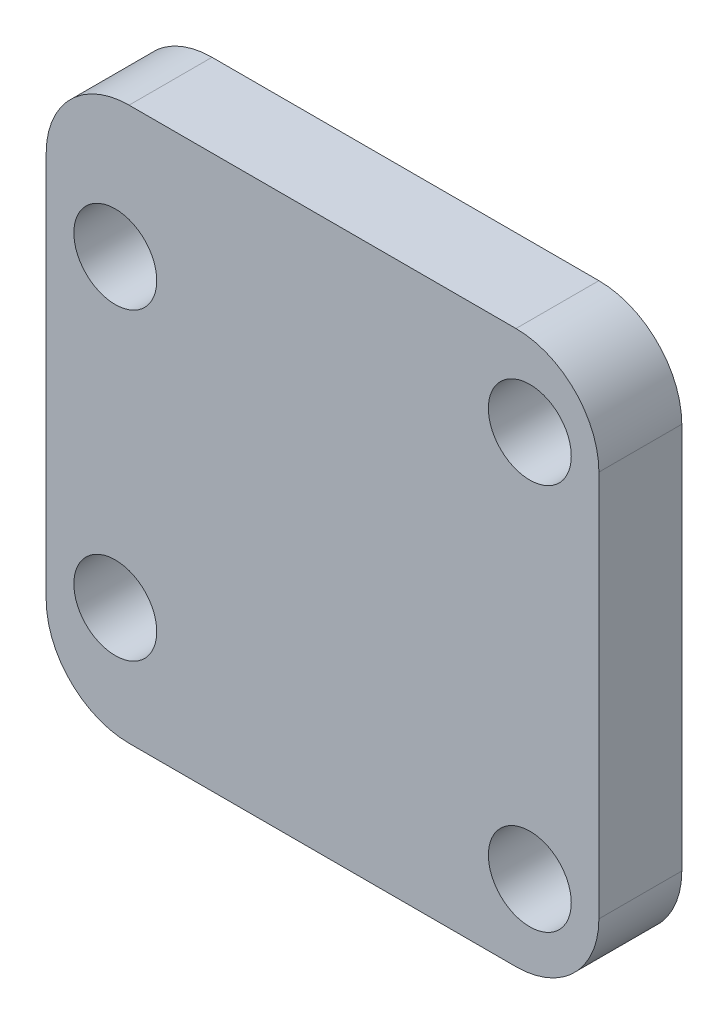
ISO-10303-21;
HEADER;
FILE_DESCRIPTION(('STEP AP214'),'2;1');
FILE_NAME('part.step','',(''),(''),'','','');
FILE_SCHEMA(('AUTOMOTIVE_DESIGN { 1 0 10303 214 1 1 1 1 }'));
ENDSEC;
DATA;
#1=APPLICATION_CONTEXT('core data for automotive mechanical design processes');
#2=APPLICATION_PROTOCOL_DEFINITION('international standard','automotive_design',2000,#1);
#3=PRODUCT_CONTEXT('',#1,'mechanical');
#4=PRODUCT('Part','Part','',(#3));
#5=PRODUCT_RELATED_PRODUCT_CATEGORY('part','',(#4));
#6=PRODUCT_DEFINITION_FORMATION('','',#4);
#7=PRODUCT_DEFINITION_CONTEXT('part definition',#1,'design');
#8=PRODUCT_DEFINITION('design','',#6,#7);
#9=PRODUCT_DEFINITION_SHAPE('','',#8);
#10=(LENGTH_UNIT() NAMED_UNIT(*) SI_UNIT(.MILLI.,.METRE.));
#11=(NAMED_UNIT(*) PLANE_ANGLE_UNIT() SI_UNIT($,.RADIAN.));
#12=(NAMED_UNIT(*) SI_UNIT($,.STERADIAN.) SOLID_ANGLE_UNIT());
#13=UNCERTAINTY_MEASURE_WITH_UNIT(LENGTH_MEASURE(1.E-05),#10,'distance_accuracy_value','');
#14=(GEOMETRIC_REPRESENTATION_CONTEXT(3) GLOBAL_UNCERTAINTY_ASSIGNED_CONTEXT((#13)) GLOBAL_UNIT_ASSIGNED_CONTEXT((#10,
#11,#12)) REPRESENTATION_CONTEXT('',''));
#15=CARTESIAN_POINT('',(0.,0.,0.));
#16=DIRECTION('',(0.,0.,1.));
#17=DIRECTION('',(1.,0.,0.));
#18=AXIS2_PLACEMENT_3D('',#15,#16,#17);
#19=CARTESIAN_POINT('',(0.,0.,3.));
#20=DIRECTION('',(0.,0.,-1.));
#21=DIRECTION('',(-1.,0.,0.));
#22=AXIS2_PLACEMENT_3D('',#19,#20,#21);
#23=PLANE('',#22);
#24=DIRECTION('',(1.,0.,0.));
#25=VECTOR('',#24,1.);
#26=CARTESIAN_POINT('',(-10.,-10.,3.));
#27=LINE('',#26,#25);
#28=CARTESIAN_POINT('',(-7.,-10.,3.));
#29=VERTEX_POINT('',#28);
#30=CARTESIAN_POINT('',(7.,-10.,3.));
#31=VERTEX_POINT('',#30);
#32=EDGE_CURVE('E152',#29,#31,#27,.T.);
#33=ORIENTED_EDGE('',*,*,#32,.T.);
#34=CARTESIAN_POINT('',(7.,-7.,3.));
#35=DIRECTION('',(0.,0.,-1.));
#36=DIRECTION('',(-1.,0.,0.));
#37=AXIS2_PLACEMENT_3D('',#34,#35,#36);
#38=CIRCLE('',#37,3.);
#39=CARTESIAN_POINT('',(10.,-7.,3.));
#40=VERTEX_POINT('',#39);
#41=EDGE_CURVE('E182',#31,#40,#38,.F.);
#42=ORIENTED_EDGE('',*,*,#41,.T.);
#43=DIRECTION('',(0.,1.,0.));
#44=VECTOR('',#43,1.);
#45=CARTESIAN_POINT('',(10.,-10.,3.));
#46=LINE('',#45,#44);
#47=CARTESIAN_POINT('',(10.,7.,3.));
#48=VERTEX_POINT('',#47);
#49=EDGE_CURVE('E131',#40,#48,#46,.T.);
#50=ORIENTED_EDGE('',*,*,#49,.T.);
#51=CARTESIAN_POINT('',(7.,7.,3.));
#52=DIRECTION('',(0.,0.,-1.));
#53=DIRECTION('',(-1.,0.,0.));
#54=AXIS2_PLACEMENT_3D('',#51,#52,#53);
#55=CIRCLE('',#54,3.);
#56=CARTESIAN_POINT('',(7.,10.,3.));
#57=VERTEX_POINT('',#56);
#58=EDGE_CURVE('E174',#48,#57,#55,.F.);
#59=ORIENTED_EDGE('',*,*,#58,.T.);
#60=DIRECTION('',(-1.,0.,0.));
#61=VECTOR('',#60,1.);
#62=CARTESIAN_POINT('',(-10.,10.,3.));
#63=LINE('',#62,#61);
#64=CARTESIAN_POINT('',(-7.,10.,3.));
#65=VERTEX_POINT('',#64);
#66=EDGE_CURVE('E197',#57,#65,#63,.T.);
#67=ORIENTED_EDGE('',*,*,#66,.T.);
#68=CARTESIAN_POINT('',(-7.,7.,3.));
#69=DIRECTION('',(0.,0.,-1.));
#70=DIRECTION('',(-1.,0.,0.));
#71=AXIS2_PLACEMENT_3D('',#68,#69,#70);
#72=CIRCLE('',#71,3.);
#73=CARTESIAN_POINT('',(-10.,7.,3.));
#74=VERTEX_POINT('',#73);
#75=EDGE_CURVE('E66',#65,#74,#72,.F.);
#76=ORIENTED_EDGE('',*,*,#75,.T.);
#77=DIRECTION('',(0.,-1.,0.));
#78=VECTOR('',#77,1.);
#79=CARTESIAN_POINT('',(-10.,-10.,3.));
#80=LINE('',#79,#78);
#81=CARTESIAN_POINT('',(-10.,-7.,3.));
#82=VERTEX_POINT('',#81);
#83=EDGE_CURVE('E205',#74,#82,#80,.T.);
#84=ORIENTED_EDGE('',*,*,#83,.T.);
#85=CARTESIAN_POINT('',(-7.,-7.,3.));
#86=DIRECTION('',(0.,0.,-1.));
#87=DIRECTION('',(-1.,0.,0.));
#88=AXIS2_PLACEMENT_3D('',#85,#86,#87);
#89=CIRCLE('',#88,3.);
#90=EDGE_CURVE('E179',#82,#29,#89,.F.);
#91=ORIENTED_EDGE('',*,*,#90,.T.);
#92=EDGE_LOOP('',(#33,#42,#50,#59,#67,#76,#84,#91));
#93=FACE_BOUND('',#92,.T.);
#94=CARTESIAN_POINT('',(7.5,7.,3.));
#95=DIRECTION('',(0.,0.,1.));
#96=DIRECTION('',(1.,0.,0.));
#97=AXIS2_PLACEMENT_3D('',#94,#95,#96);
#98=CIRCLE('',#97,1.5);
#99=CARTESIAN_POINT('',(9.,7.,3.));
#100=VERTEX_POINT('',#99);
#101=EDGE_CURVE('E141',#100,#100,#98,.T.);
#102=ORIENTED_EDGE('',*,*,#101,.F.);
#103=EDGE_LOOP('',(#102));
#104=FACE_BOUND('',#103,.T.);
#105=CARTESIAN_POINT('',(7.5,-7.,3.));
#106=DIRECTION('',(0.,0.,1.));
#107=DIRECTION('',(1.,0.,0.));
#108=AXIS2_PLACEMENT_3D('',#105,#106,#107);
#109=CIRCLE('',#108,1.5);
#110=CARTESIAN_POINT('',(9.,-7.,3.));
#111=VERTEX_POINT('',#110);
#112=EDGE_CURVE('E217',#111,#111,#109,.T.);
#113=ORIENTED_EDGE('',*,*,#112,.F.);
#114=EDGE_LOOP('',(#113));
#115=FACE_BOUND('',#114,.T.);
#116=CARTESIAN_POINT('',(-7.5,5.,3.));
#117=DIRECTION('',(0.,0.,1.));
#118=DIRECTION('',(1.,0.,0.));
#119=AXIS2_PLACEMENT_3D('',#116,#117,#118);
#120=CIRCLE('',#119,1.5);
#121=CARTESIAN_POINT('',(-6.,5.,3.));
#122=VERTEX_POINT('',#121);
#123=EDGE_CURVE('E223',#122,#122,#120,.T.);
#124=ORIENTED_EDGE('',*,*,#123,.F.);
#125=EDGE_LOOP('',(#124));
#126=FACE_BOUND('',#125,.T.);
#127=CARTESIAN_POINT('',(-7.5,-6.,3.));
#128=DIRECTION('',(0.,0.,1.));
#129=DIRECTION('',(1.,0.,0.));
#130=AXIS2_PLACEMENT_3D('',#127,#128,#129);
#131=CIRCLE('',#130,1.5);
#132=CARTESIAN_POINT('',(-6.,-6.,3.));
#133=VERTEX_POINT('',#132);
#134=EDGE_CURVE('E231',#133,#133,#131,.T.);
#135=ORIENTED_EDGE('',*,*,#134,.F.);
#136=EDGE_LOOP('',(#135));
#137=FACE_BOUND('',#136,.T.);
#138=ADVANCED_FACE('F43',(#93,#104,#115,#126,#137),#23,.F.);
#139=CARTESIAN_POINT('',(0.,0.,0.));
#140=DIRECTION('',(0.,0.,-1.));
#141=DIRECTION('',(-1.,0.,0.));
#142=AXIS2_PLACEMENT_3D('',#139,#140,#141);
#143=PLANE('',#142);
#144=CARTESIAN_POINT('',(-7.5,5.,0.));
#145=DIRECTION('',(0.,0.,1.));
#146=DIRECTION('',(1.,0.,0.));
#147=AXIS2_PLACEMENT_3D('',#144,#145,#146);
#148=CIRCLE('',#147,1.5);
#149=CARTESIAN_POINT('',(-6.,5.,0.));
#150=VERTEX_POINT('',#149);
#151=EDGE_CURVE('E227',#150,#150,#148,.T.);
#152=ORIENTED_EDGE('',*,*,#151,.T.);
#153=EDGE_LOOP('',(#152));
#154=FACE_BOUND('',#153,.T.);
#155=CARTESIAN_POINT('',(7.5,7.,0.));
#156=DIRECTION('',(0.,0.,1.));
#157=DIRECTION('',(1.,0.,0.));
#158=AXIS2_PLACEMENT_3D('',#155,#156,#157);
#159=CIRCLE('',#158,1.5);
#160=CARTESIAN_POINT('',(9.,7.,0.));
#161=VERTEX_POINT('',#160);
#162=EDGE_CURVE('E149',#161,#161,#159,.T.);
#163=ORIENTED_EDGE('',*,*,#162,.T.);
#164=EDGE_LOOP('',(#163));
#165=FACE_BOUND('',#164,.T.);
#166=DIRECTION('',(0.,1.,0.));
#167=VECTOR('',#166,1.);
#168=CARTESIAN_POINT('',(10.,-10.,0.));
#169=LINE('',#168,#167);
#170=CARTESIAN_POINT('',(10.,-7.,0.));
#171=VERTEX_POINT('',#170);
#172=CARTESIAN_POINT('',(10.,7.,0.));
#173=VERTEX_POINT('',#172);
#174=EDGE_CURVE('E128',#171,#173,#169,.T.);
#175=ORIENTED_EDGE('',*,*,#174,.F.);
#176=CARTESIAN_POINT('',(7.,-7.,0.));
#177=DIRECTION('',(0.,0.,-1.));
#178=DIRECTION('',(-1.,0.,0.));
#179=AXIS2_PLACEMENT_3D('',#176,#177,#178);
#180=CIRCLE('',#179,3.);
#181=CARTESIAN_POINT('',(7.,-10.,0.));
#182=VERTEX_POINT('',#181);
#183=EDGE_CURVE('E110',#171,#182,#180,.T.);
#184=ORIENTED_EDGE('',*,*,#183,.T.);
#185=DIRECTION('',(1.,0.,0.));
#186=VECTOR('',#185,1.);
#187=CARTESIAN_POINT('',(-10.,-10.,0.));
#188=LINE('',#187,#186);
#189=CARTESIAN_POINT('',(-7.,-10.,0.));
#190=VERTEX_POINT('',#189);
#191=EDGE_CURVE('E157',#190,#182,#188,.T.);
#192=ORIENTED_EDGE('',*,*,#191,.F.);
#193=CARTESIAN_POINT('',(-7.,-7.,0.));
#194=DIRECTION('',(0.,0.,-1.));
#195=DIRECTION('',(-1.,0.,0.));
#196=AXIS2_PLACEMENT_3D('',#193,#194,#195);
#197=CIRCLE('',#196,3.);
#198=CARTESIAN_POINT('',(-10.,-7.,0.));
#199=VERTEX_POINT('',#198);
#200=EDGE_CURVE('E122',#190,#199,#197,.T.);
#201=ORIENTED_EDGE('',*,*,#200,.T.);
#202=DIRECTION('',(0.,-1.,0.));
#203=VECTOR('',#202,1.);
#204=CARTESIAN_POINT('',(-10.,-10.,0.));
#205=LINE('',#204,#203);
#206=CARTESIAN_POINT('',(-10.,7.,0.));
#207=VERTEX_POINT('',#206);
#208=EDGE_CURVE('E146',#207,#199,#205,.T.);
#209=ORIENTED_EDGE('',*,*,#208,.F.);
#210=CARTESIAN_POINT('',(-7.,7.,0.));
#211=DIRECTION('',(0.,0.,-1.));
#212=DIRECTION('',(-1.,0.,0.));
#213=AXIS2_PLACEMENT_3D('',#210,#211,#212);
#214=CIRCLE('',#213,3.);
#215=CARTESIAN_POINT('',(-7.,10.,0.));
#216=VERTEX_POINT('',#215);
#217=EDGE_CURVE('E164',#207,#216,#214,.T.);
#218=ORIENTED_EDGE('',*,*,#217,.T.);
#219=DIRECTION('',(-1.,0.,0.));
#220=VECTOR('',#219,1.);
#221=CARTESIAN_POINT('',(-10.,10.,0.));
#222=LINE('',#221,#220);
#223=CARTESIAN_POINT('',(7.,10.,0.));
#224=VERTEX_POINT('',#223);
#225=EDGE_CURVE('E140',#224,#216,#222,.T.);
#226=ORIENTED_EDGE('',*,*,#225,.F.);
#227=CARTESIAN_POINT('',(7.,7.,0.));
#228=DIRECTION('',(0.,0.,-1.));
#229=DIRECTION('',(-1.,0.,0.));
#230=AXIS2_PLACEMENT_3D('',#227,#228,#229);
#231=CIRCLE('',#230,3.);
#232=EDGE_CURVE('E133',#224,#173,#231,.T.);
#233=ORIENTED_EDGE('',*,*,#232,.T.);
#234=EDGE_LOOP('',(#175,#184,#192,#201,#209,#218,#226,#233));
#235=FACE_BOUND('',#234,.T.);
#236=CARTESIAN_POINT('',(7.5,-7.,0.));
#237=DIRECTION('',(0.,0.,1.));
#238=DIRECTION('',(1.,0.,0.));
#239=AXIS2_PLACEMENT_3D('',#236,#237,#238);
#240=CIRCLE('',#239,1.5);
#241=CARTESIAN_POINT('',(9.,-7.,0.));
#242=VERTEX_POINT('',#241);
#243=EDGE_CURVE('E219',#242,#242,#240,.T.);
#244=ORIENTED_EDGE('',*,*,#243,.T.);
#245=EDGE_LOOP('',(#244));
#246=FACE_BOUND('',#245,.T.);
#247=CARTESIAN_POINT('',(-7.5,-6.,0.));
#248=DIRECTION('',(0.,0.,1.));
#249=DIRECTION('',(1.,0.,0.));
#250=AXIS2_PLACEMENT_3D('',#247,#248,#249);
#251=CIRCLE('',#250,1.5);
#252=CARTESIAN_POINT('',(-6.,-6.,0.));
#253=VERTEX_POINT('',#252);
#254=EDGE_CURVE('E235',#253,#253,#251,.T.);
#255=ORIENTED_EDGE('',*,*,#254,.T.);
#256=EDGE_LOOP('',(#255));
#257=FACE_BOUND('',#256,.T.);
#258=ADVANCED_FACE('F136',(#154,#165,#235,#246,#257),#143,.T.);
#259=CARTESIAN_POINT('',(10.,-10.,3.));
#260=DIRECTION('',(-1.,0.,0.));
#261=DIRECTION('',(0.,-1.,0.));
#262=AXIS2_PLACEMENT_3D('',#259,#260,#261);
#263=PLANE('',#262);
#264=ORIENTED_EDGE('',*,*,#49,.F.);
#265=DIRECTION('',(0.,0.,-1.));
#266=VECTOR('',#265,1.);
#267=CARTESIAN_POINT('',(10.,-7.,3.));
#268=LINE('',#267,#266);
#269=EDGE_CURVE('E114',#40,#171,#268,.T.);
#270=ORIENTED_EDGE('',*,*,#269,.T.);
#271=ORIENTED_EDGE('',*,*,#174,.T.);
#272=DIRECTION('',(0.,0.,-1.));
#273=VECTOR('',#272,1.);
#274=CARTESIAN_POINT('',(10.,7.,3.));
#275=LINE('',#274,#273);
#276=EDGE_CURVE('E134',#173,#48,#275,.F.);
#277=ORIENTED_EDGE('',*,*,#276,.T.);
#278=EDGE_LOOP('',(#264,#270,#271,#277));
#279=FACE_BOUND('',#278,.T.);
#280=ADVANCED_FACE('F127',(#279),#263,.F.);
#281=CARTESIAN_POINT('',(-10.,10.,3.));
#282=DIRECTION('',(0.,-1.,0.));
#283=DIRECTION('',(0.,0.,-1.));
#284=AXIS2_PLACEMENT_3D('',#281,#282,#283);
#285=PLANE('',#284);
#286=ORIENTED_EDGE('',*,*,#225,.T.);
#287=DIRECTION('',(0.,0.,-1.));
#288=VECTOR('',#287,1.);
#289=CARTESIAN_POINT('',(-7.,10.,3.));
#290=LINE('',#289,#288);
#291=EDGE_CURVE('E11',#216,#65,#290,.F.);
#292=ORIENTED_EDGE('',*,*,#291,.T.);
#293=ORIENTED_EDGE('',*,*,#66,.F.);
#294=DIRECTION('',(0.,0.,-1.));
#295=VECTOR('',#294,1.);
#296=CARTESIAN_POINT('',(7.,10.,3.));
#297=LINE('',#296,#295);
#298=EDGE_CURVE('E52',#57,#224,#297,.T.);
#299=ORIENTED_EDGE('',*,*,#298,.T.);
#300=EDGE_LOOP('',(#286,#292,#293,#299));
#301=FACE_BOUND('',#300,.T.);
#302=ADVANCED_FACE('F195',(#301),#285,.F.);
#303=CARTESIAN_POINT('',(-10.,-10.,3.));
#304=DIRECTION('',(1.,0.,0.));
#305=DIRECTION('',(0.,0.,-1.));
#306=AXIS2_PLACEMENT_3D('',#303,#304,#305);
#307=PLANE('',#306);
#308=ORIENTED_EDGE('',*,*,#208,.T.);
#309=DIRECTION('',(0.,0.,-1.));
#310=VECTOR('',#309,1.);
#311=CARTESIAN_POINT('',(-10.,-7.,3.));
#312=LINE('',#311,#310);
#313=EDGE_CURVE('E59',#199,#82,#312,.F.);
#314=ORIENTED_EDGE('',*,*,#313,.T.);
#315=ORIENTED_EDGE('',*,*,#83,.F.);
#316=DIRECTION('',(0.,0.,-1.));
#317=VECTOR('',#316,1.);
#318=CARTESIAN_POINT('',(-10.,7.,3.));
#319=LINE('',#318,#317);
#320=EDGE_CURVE('E185',#74,#207,#319,.T.);
#321=ORIENTED_EDGE('',*,*,#320,.T.);
#322=EDGE_LOOP('',(#308,#314,#315,#321));
#323=FACE_BOUND('',#322,.T.);
#324=ADVANCED_FACE('F204',(#323),#307,.F.);
#325=CARTESIAN_POINT('',(-10.,-10.,3.));
#326=DIRECTION('',(0.,1.,0.));
#327=DIRECTION('',(0.,0.,1.));
#328=AXIS2_PLACEMENT_3D('',#325,#326,#327);
#329=PLANE('',#328);
#330=ORIENTED_EDGE('',*,*,#191,.T.);
#331=DIRECTION('',(0.,0.,-1.));
#332=VECTOR('',#331,1.);
#333=CARTESIAN_POINT('',(7.,-10.,3.));
#334=LINE('',#333,#332);
#335=EDGE_CURVE('E115',#182,#31,#334,.F.);
#336=ORIENTED_EDGE('',*,*,#335,.T.);
#337=ORIENTED_EDGE('',*,*,#32,.F.);
#338=DIRECTION('',(0.,0.,-1.));
#339=VECTOR('',#338,1.);
#340=CARTESIAN_POINT('',(-7.,-10.,3.));
#341=LINE('',#340,#339);
#342=EDGE_CURVE('E121',#29,#190,#341,.T.);
#343=ORIENTED_EDGE('',*,*,#342,.T.);
#344=EDGE_LOOP('',(#330,#336,#337,#343));
#345=FACE_BOUND('',#344,.T.);
#346=ADVANCED_FACE('F258',(#345),#329,.F.);
#347=CARTESIAN_POINT('',(7.5,7.,3.));
#348=DIRECTION('',(0.,0.,-1.));
#349=DIRECTION('',(-1.,0.,0.));
#350=AXIS2_PLACEMENT_3D('',#347,#348,#349);
#351=CYLINDRICAL_SURFACE('',#350,1.5);
#352=ORIENTED_EDGE('',*,*,#101,.T.);
#353=EDGE_LOOP('',(#352));
#354=FACE_BOUND('',#353,.T.);
#355=ORIENTED_EDGE('',*,*,#162,.F.);
#356=EDGE_LOOP('',(#355));
#357=FACE_BOUND('',#356,.T.);
#358=ADVANCED_FACE('F255',(#354,#357),#351,.F.);
#359=CARTESIAN_POINT('',(7.5,-7.,3.));
#360=DIRECTION('',(0.,0.,-1.));
#361=DIRECTION('',(-1.,0.,0.));
#362=AXIS2_PLACEMENT_3D('',#359,#360,#361);
#363=CYLINDRICAL_SURFACE('',#362,1.5);
#364=ORIENTED_EDGE('',*,*,#112,.T.);
#365=EDGE_LOOP('',(#364));
#366=FACE_BOUND('',#365,.T.);
#367=ORIENTED_EDGE('',*,*,#243,.F.);
#368=EDGE_LOOP('',(#367));
#369=FACE_BOUND('',#368,.T.);
#370=ADVANCED_FACE('F362',(#366,#369),#363,.F.);
#371=CARTESIAN_POINT('',(-7.5,5.,3.));
#372=DIRECTION('',(0.,0.,-1.));
#373=DIRECTION('',(-1.,0.,0.));
#374=AXIS2_PLACEMENT_3D('',#371,#372,#373);
#375=CYLINDRICAL_SURFACE('',#374,1.5);
#376=ORIENTED_EDGE('',*,*,#123,.T.);
#377=EDGE_LOOP('',(#376));
#378=FACE_BOUND('',#377,.T.);
#379=ORIENTED_EDGE('',*,*,#151,.F.);
#380=EDGE_LOOP('',(#379));
#381=FACE_BOUND('',#380,.T.);
#382=ADVANCED_FACE('F352',(#378,#381),#375,.F.);
#383=CARTESIAN_POINT('',(-7.5,-6.,3.));
#384=DIRECTION('',(0.,0.,-1.));
#385=DIRECTION('',(-1.,0.,0.));
#386=AXIS2_PLACEMENT_3D('',#383,#384,#385);
#387=CYLINDRICAL_SURFACE('',#386,1.5);
#388=ORIENTED_EDGE('',*,*,#134,.T.);
#389=EDGE_LOOP('',(#388));
#390=FACE_BOUND('',#389,.T.);
#391=ORIENTED_EDGE('',*,*,#254,.F.);
#392=EDGE_LOOP('',(#391));
#393=FACE_BOUND('',#392,.T.);
#394=ADVANCED_FACE('F243',(#390,#393),#387,.F.);
#395=CARTESIAN_POINT('',(7.,-7.,3.));
#396=DIRECTION('',(0.,0.,-1.));
#397=DIRECTION('',(-1.,0.,0.));
#398=AXIS2_PLACEMENT_3D('',#395,#396,#397);
#399=CYLINDRICAL_SURFACE('',#398,3.);
#400=ORIENTED_EDGE('',*,*,#41,.F.);
#401=ORIENTED_EDGE('',*,*,#335,.F.);
#402=ORIENTED_EDGE('',*,*,#183,.F.);
#403=ORIENTED_EDGE('',*,*,#269,.F.);
#404=EDGE_LOOP('',(#400,#401,#402,#403));
#405=FACE_BOUND('',#404,.T.);
#406=ADVANCED_FACE('F113',(#405),#399,.T.);
#407=CARTESIAN_POINT('',(-7.,-7.,3.));
#408=DIRECTION('',(0.,0.,-1.));
#409=DIRECTION('',(-1.,0.,0.));
#410=AXIS2_PLACEMENT_3D('',#407,#408,#409);
#411=CYLINDRICAL_SURFACE('',#410,3.);
#412=ORIENTED_EDGE('',*,*,#90,.F.);
#413=ORIENTED_EDGE('',*,*,#313,.F.);
#414=ORIENTED_EDGE('',*,*,#200,.F.);
#415=ORIENTED_EDGE('',*,*,#342,.F.);
#416=EDGE_LOOP('',(#412,#413,#414,#415));
#417=FACE_BOUND('',#416,.T.);
#418=ADVANCED_FACE('F270',(#417),#411,.T.);
#419=CARTESIAN_POINT('',(-7.,7.,3.));
#420=DIRECTION('',(0.,0.,-1.));
#421=DIRECTION('',(-1.,0.,0.));
#422=AXIS2_PLACEMENT_3D('',#419,#420,#421);
#423=CYLINDRICAL_SURFACE('',#422,3.);
#424=ORIENTED_EDGE('',*,*,#75,.F.);
#425=ORIENTED_EDGE('',*,*,#291,.F.);
#426=ORIENTED_EDGE('',*,*,#217,.F.);
#427=ORIENTED_EDGE('',*,*,#320,.F.);
#428=EDGE_LOOP('',(#424,#425,#426,#427));
#429=FACE_BOUND('',#428,.T.);
#430=ADVANCED_FACE('F203',(#429),#423,.T.);
#431=CARTESIAN_POINT('',(7.,7.,3.));
#432=DIRECTION('',(0.,0.,-1.));
#433=DIRECTION('',(-1.,0.,0.));
#434=AXIS2_PLACEMENT_3D('',#431,#432,#433);
#435=CYLINDRICAL_SURFACE('',#434,3.);
#436=ORIENTED_EDGE('',*,*,#58,.F.);
#437=ORIENTED_EDGE('',*,*,#276,.F.);
#438=ORIENTED_EDGE('',*,*,#232,.F.);
#439=ORIENTED_EDGE('',*,*,#298,.F.);
#440=EDGE_LOOP('',(#436,#437,#438,#439));
#441=FACE_BOUND('',#440,.T.);
#442=ADVANCED_FACE('F45',(#441),#435,.T.);
#443=CLOSED_SHELL('',(#138,#258,#280,#302,#324,#346,#358,#370,#382,#394,#406,#418,#430,#442));
#444=MANIFOLD_SOLID_BREP('B2',#443);
#445=ADVANCED_BREP_SHAPE_REPRESENTATION('',(#18,#444),#14);
#446=SHAPE_DEFINITION_REPRESENTATION(#9,#445);
ENDSEC;
END-ISO-10303-21;
